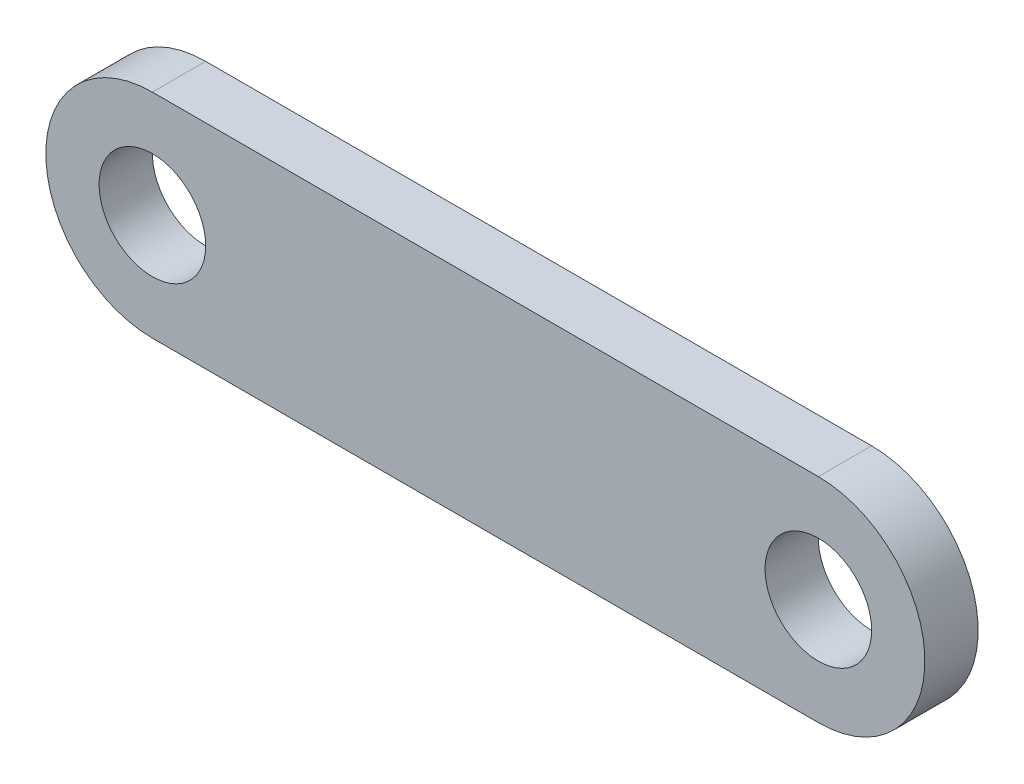
ISO-10303-21;
HEADER;
FILE_DESCRIPTION(('STEP AP214'),'2;1');
FILE_NAME('part.step','',(''),(''),'','','');
FILE_SCHEMA(('AUTOMOTIVE_DESIGN { 1 0 10303 214 1 1 1 1 }'));
ENDSEC;
DATA;
#1=APPLICATION_CONTEXT('core data for automotive mechanical design processes');
#2=APPLICATION_PROTOCOL_DEFINITION('international standard','automotive_design',2000,#1);
#3=PRODUCT_CONTEXT('',#1,'mechanical');
#4=PRODUCT('Part','Part','',(#3));
#5=PRODUCT_RELATED_PRODUCT_CATEGORY('part','',(#4));
#6=PRODUCT_DEFINITION_FORMATION('','',#4);
#7=PRODUCT_DEFINITION_CONTEXT('part definition',#1,'design');
#8=PRODUCT_DEFINITION('design','',#6,#7);
#9=PRODUCT_DEFINITION_SHAPE('','',#8);
#10=(LENGTH_UNIT() NAMED_UNIT(*) SI_UNIT(.MILLI.,.METRE.));
#11=(NAMED_UNIT(*) PLANE_ANGLE_UNIT() SI_UNIT($,.RADIAN.));
#12=(NAMED_UNIT(*) SI_UNIT($,.STERADIAN.) SOLID_ANGLE_UNIT());
#13=UNCERTAINTY_MEASURE_WITH_UNIT(LENGTH_MEASURE(1.E-05),#10,'distance_accuracy_value','');
#14=(GEOMETRIC_REPRESENTATION_CONTEXT(3) GLOBAL_UNCERTAINTY_ASSIGNED_CONTEXT((#13)) GLOBAL_UNIT_ASSIGNED_CONTEXT((#10,
#11,#12)) REPRESENTATION_CONTEXT('',''));
#15=CARTESIAN_POINT('',(0.,0.,0.));
#16=DIRECTION('',(0.,0.,1.));
#17=DIRECTION('',(1.,0.,0.));
#18=AXIS2_PLACEMENT_3D('',#15,#16,#17);
#19=CARTESIAN_POINT('',(0.,0.,2.5));
#20=DIRECTION('',(0.,0.,1.));
#21=DIRECTION('',(1.,0.,0.));
#22=AXIS2_PLACEMENT_3D('',#19,#20,#21);
#23=PLANE('',#22);
#24=CARTESIAN_POINT('',(-62.5,0.,2.5));
#25=DIRECTION('',(0.,0.,1.));
#26=DIRECTION('',(1.,0.,0.));
#27=AXIS2_PLACEMENT_3D('',#24,#25,#26);
#28=CIRCLE('',#27,5.);
#29=CARTESIAN_POINT('',(-57.5,0.,2.5));
#30=VERTEX_POINT('',#29);
#31=EDGE_CURVE('E106',#30,#30,#28,.T.);
#32=ORIENTED_EDGE('',*,*,#31,.F.);
#33=EDGE_LOOP('',(#32));
#34=FACE_BOUND('',#33,.T.);
#35=CARTESIAN_POINT('',(0.,0.,2.5));
#36=DIRECTION('',(0.,0.,1.));
#37=DIRECTION('',(1.,0.,0.));
#38=AXIS2_PLACEMENT_3D('',#35,#36,#37);
#39=CIRCLE('',#38,10.);
#40=CARTESIAN_POINT('',(0.,-10.,2.5));
#41=VERTEX_POINT('',#40);
#42=CARTESIAN_POINT('',(0.,10.,2.5));
#43=VERTEX_POINT('',#42);
#44=EDGE_CURVE('E91',#41,#43,#39,.T.);
#45=ORIENTED_EDGE('',*,*,#44,.T.);
#46=DIRECTION('',(-1.,0.,0.));
#47=VECTOR('',#46,1.);
#48=CARTESIAN_POINT('',(0.,10.,2.5));
#49=LINE('',#48,#47);
#50=CARTESIAN_POINT('',(-62.5,9.99999999999999,2.5));
#51=VERTEX_POINT('',#50);
#52=EDGE_CURVE('E86',#43,#51,#49,.T.);
#53=ORIENTED_EDGE('',*,*,#52,.T.);
#54=CARTESIAN_POINT('',(-62.5,0.,2.5));
#55=DIRECTION('',(0.,0.,1.));
#56=DIRECTION('',(1.,0.,0.));
#57=AXIS2_PLACEMENT_3D('',#54,#55,#56);
#58=CIRCLE('',#57,10.);
#59=CARTESIAN_POINT('',(-62.5,-10.,2.5));
#60=VERTEX_POINT('',#59);
#61=EDGE_CURVE('E87',#51,#60,#58,.T.);
#62=ORIENTED_EDGE('',*,*,#61,.T.);
#63=DIRECTION('',(1.,0.,0.));
#64=VECTOR('',#63,1.);
#65=CARTESIAN_POINT('',(0.,-10.,2.5));
#66=LINE('',#65,#64);
#67=EDGE_CURVE('E57',#60,#41,#66,.T.);
#68=ORIENTED_EDGE('',*,*,#67,.T.);
#69=EDGE_LOOP('',(#45,#53,#62,#68));
#70=FACE_BOUND('',#69,.T.);
#71=CARTESIAN_POINT('',(0.,0.,2.5));
#72=DIRECTION('',(0.,0.,1.));
#73=DIRECTION('',(1.,0.,0.));
#74=AXIS2_PLACEMENT_3D('',#71,#72,#73);
#75=CIRCLE('',#74,5.);
#76=CARTESIAN_POINT('',(5.,0.,2.5));
#77=VERTEX_POINT('',#76);
#78=EDGE_CURVE('E123',#77,#77,#75,.T.);
#79=ORIENTED_EDGE('',*,*,#78,.F.);
#80=EDGE_LOOP('',(#79));
#81=FACE_BOUND('',#80,.T.);
#82=ADVANCED_FACE('F39',(#34,#70,#81),#23,.T.);
#83=CARTESIAN_POINT('',(0.,0.,-2.5));
#84=DIRECTION('',(0.,0.,1.));
#85=DIRECTION('',(1.,0.,0.));
#86=AXIS2_PLACEMENT_3D('',#83,#84,#85);
#87=PLANE('',#86);
#88=CARTESIAN_POINT('',(0.,0.,-2.5));
#89=DIRECTION('',(0.,0.,1.));
#90=DIRECTION('',(1.,0.,0.));
#91=AXIS2_PLACEMENT_3D('',#88,#89,#90);
#92=CIRCLE('',#91,10.);
#93=CARTESIAN_POINT('',(0.,-10.,-2.5));
#94=VERTEX_POINT('',#93);
#95=CARTESIAN_POINT('',(0.,10.,-2.5));
#96=VERTEX_POINT('',#95);
#97=EDGE_CURVE('E104',#94,#96,#92,.T.);
#98=ORIENTED_EDGE('',*,*,#97,.F.);
#99=DIRECTION('',(1.,0.,0.));
#100=VECTOR('',#99,1.);
#101=CARTESIAN_POINT('',(0.,-10.,-2.5));
#102=LINE('',#101,#100);
#103=CARTESIAN_POINT('',(-62.5,-10.,-2.5));
#104=VERTEX_POINT('',#103);
#105=EDGE_CURVE('E80',#104,#94,#102,.T.);
#106=ORIENTED_EDGE('',*,*,#105,.F.);
#107=CARTESIAN_POINT('',(-62.5,0.,-2.5));
#108=DIRECTION('',(0.,0.,1.));
#109=DIRECTION('',(1.,0.,0.));
#110=AXIS2_PLACEMENT_3D('',#107,#108,#109);
#111=CIRCLE('',#110,10.);
#112=CARTESIAN_POINT('',(-62.5,9.99999999999999,-2.5));
#113=VERTEX_POINT('',#112);
#114=EDGE_CURVE('E74',#113,#104,#111,.T.);
#115=ORIENTED_EDGE('',*,*,#114,.F.);
#116=DIRECTION('',(-1.,0.,0.));
#117=VECTOR('',#116,1.);
#118=CARTESIAN_POINT('',(0.,10.,-2.5));
#119=LINE('',#118,#117);
#120=EDGE_CURVE('E94',#96,#113,#119,.T.);
#121=ORIENTED_EDGE('',*,*,#120,.F.);
#122=EDGE_LOOP('',(#98,#106,#115,#121));
#123=FACE_BOUND('',#122,.T.);
#124=CARTESIAN_POINT('',(-62.5,0.,-2.5));
#125=DIRECTION('',(0.,0.,1.));
#126=DIRECTION('',(1.,0.,0.));
#127=AXIS2_PLACEMENT_3D('',#124,#125,#126);
#128=CIRCLE('',#127,5.);
#129=CARTESIAN_POINT('',(-57.5,0.,-2.5));
#130=VERTEX_POINT('',#129);
#131=EDGE_CURVE('E119',#130,#130,#128,.T.);
#132=ORIENTED_EDGE('',*,*,#131,.T.);
#133=EDGE_LOOP('',(#132));
#134=FACE_BOUND('',#133,.T.);
#135=CARTESIAN_POINT('',(0.,0.,-2.5));
#136=DIRECTION('',(0.,0.,1.));
#137=DIRECTION('',(1.,0.,0.));
#138=AXIS2_PLACEMENT_3D('',#135,#136,#137);
#139=CIRCLE('',#138,5.);
#140=CARTESIAN_POINT('',(5.,0.,-2.5));
#141=VERTEX_POINT('',#140);
#142=EDGE_CURVE('E125',#141,#141,#139,.T.);
#143=ORIENTED_EDGE('',*,*,#142,.T.);
#144=EDGE_LOOP('',(#143));
#145=FACE_BOUND('',#144,.T.);
#146=ADVANCED_FACE('F114',(#123,#134,#145),#87,.F.);
#147=CARTESIAN_POINT('',(0.,0.,2.5));
#148=DIRECTION('',(0.,0.,-1.));
#149=DIRECTION('',(-1.,0.,0.));
#150=AXIS2_PLACEMENT_3D('',#147,#148,#149);
#151=CYLINDRICAL_SURFACE('',#150,10.);
#152=ORIENTED_EDGE('',*,*,#97,.T.);
#153=DIRECTION('',(0.,0.,-1.));
#154=VECTOR('',#153,1.);
#155=CARTESIAN_POINT('',(0.,10.,2.5));
#156=LINE('',#155,#154);
#157=EDGE_CURVE('E11',#43,#96,#156,.T.);
#158=ORIENTED_EDGE('',*,*,#157,.F.);
#159=ORIENTED_EDGE('',*,*,#44,.F.);
#160=DIRECTION('',(0.,0.,-1.));
#161=VECTOR('',#160,1.);
#162=CARTESIAN_POINT('',(0.,-10.,2.5));
#163=LINE('',#162,#161);
#164=EDGE_CURVE('E98',#41,#94,#163,.T.);
#165=ORIENTED_EDGE('',*,*,#164,.T.);
#166=EDGE_LOOP('',(#152,#158,#159,#165));
#167=FACE_BOUND('',#166,.T.);
#168=ADVANCED_FACE('F41',(#167),#151,.T.);
#169=CARTESIAN_POINT('',(0.,10.,2.5));
#170=DIRECTION('',(0.,-1.,0.));
#171=DIRECTION('',(1.,0.,0.));
#172=AXIS2_PLACEMENT_3D('',#169,#170,#171);
#173=PLANE('',#172);
#174=ORIENTED_EDGE('',*,*,#120,.T.);
#175=DIRECTION('',(0.,0.,-1.));
#176=VECTOR('',#175,1.);
#177=CARTESIAN_POINT('',(-62.5,9.99999999999999,2.5));
#178=LINE('',#177,#176);
#179=EDGE_CURVE('E48',#51,#113,#178,.T.);
#180=ORIENTED_EDGE('',*,*,#179,.F.);
#181=ORIENTED_EDGE('',*,*,#52,.F.);
#182=ORIENTED_EDGE('',*,*,#157,.T.);
#183=EDGE_LOOP('',(#174,#180,#181,#182));
#184=FACE_BOUND('',#183,.T.);
#185=ADVANCED_FACE('F92',(#184),#173,.F.);
#186=CARTESIAN_POINT('',(-62.5,0.,2.5));
#187=DIRECTION('',(0.,0.,-1.));
#188=DIRECTION('',(-1.,0.,0.));
#189=AXIS2_PLACEMENT_3D('',#186,#187,#188);
#190=CYLINDRICAL_SURFACE('',#189,10.);
#191=ORIENTED_EDGE('',*,*,#114,.T.);
#192=DIRECTION('',(0.,0.,-1.));
#193=VECTOR('',#192,1.);
#194=CARTESIAN_POINT('',(-62.5,-10.,2.5));
#195=LINE('',#194,#193);
#196=EDGE_CURVE('E96',#60,#104,#195,.T.);
#197=ORIENTED_EDGE('',*,*,#196,.F.);
#198=ORIENTED_EDGE('',*,*,#61,.F.);
#199=ORIENTED_EDGE('',*,*,#179,.T.);
#200=EDGE_LOOP('',(#191,#197,#198,#199));
#201=FACE_BOUND('',#200,.T.);
#202=ADVANCED_FACE('F100',(#201),#190,.T.);
#203=CARTESIAN_POINT('',(0.,-10.,2.5));
#204=DIRECTION('',(0.,1.,0.));
#205=DIRECTION('',(-1.,0.,0.));
#206=AXIS2_PLACEMENT_3D('',#203,#204,#205);
#207=PLANE('',#206);
#208=ORIENTED_EDGE('',*,*,#105,.T.);
#209=ORIENTED_EDGE('',*,*,#164,.F.);
#210=ORIENTED_EDGE('',*,*,#67,.F.);
#211=ORIENTED_EDGE('',*,*,#196,.T.);
#212=EDGE_LOOP('',(#208,#209,#210,#211));
#213=FACE_BOUND('',#212,.T.);
#214=ADVANCED_FACE('F112',(#213),#207,.F.);
#215=CARTESIAN_POINT('',(-62.5,0.,2.5));
#216=DIRECTION('',(0.,0.,-1.));
#217=DIRECTION('',(-1.,0.,0.));
#218=AXIS2_PLACEMENT_3D('',#215,#216,#217);
#219=CYLINDRICAL_SURFACE('',#218,5.);
#220=ORIENTED_EDGE('',*,*,#31,.T.);
#221=EDGE_LOOP('',(#220));
#222=FACE_BOUND('',#221,.T.);
#223=ORIENTED_EDGE('',*,*,#131,.F.);
#224=EDGE_LOOP('',(#223));
#225=FACE_BOUND('',#224,.T.);
#226=ADVANCED_FACE('F141',(#222,#225),#219,.F.);
#227=CARTESIAN_POINT('',(0.,0.,2.5));
#228=DIRECTION('',(0.,0.,-1.));
#229=DIRECTION('',(-1.,0.,0.));
#230=AXIS2_PLACEMENT_3D('',#227,#228,#229);
#231=CYLINDRICAL_SURFACE('',#230,5.);
#232=ORIENTED_EDGE('',*,*,#78,.T.);
#233=EDGE_LOOP('',(#232));
#234=FACE_BOUND('',#233,.T.);
#235=ORIENTED_EDGE('',*,*,#142,.F.);
#236=EDGE_LOOP('',(#235));
#237=FACE_BOUND('',#236,.T.);
#238=ADVANCED_FACE('F127',(#234,#237),#231,.F.);
#239=CLOSED_SHELL('',(#82,#146,#168,#185,#202,#214,#226,#238));
#240=MANIFOLD_SOLID_BREP('B2',#239);
#241=ADVANCED_BREP_SHAPE_REPRESENTATION('',(#18,#240),#14);
#242=SHAPE_DEFINITION_REPRESENTATION(#9,#241);
ENDSEC;
END-ISO-10303-21;
